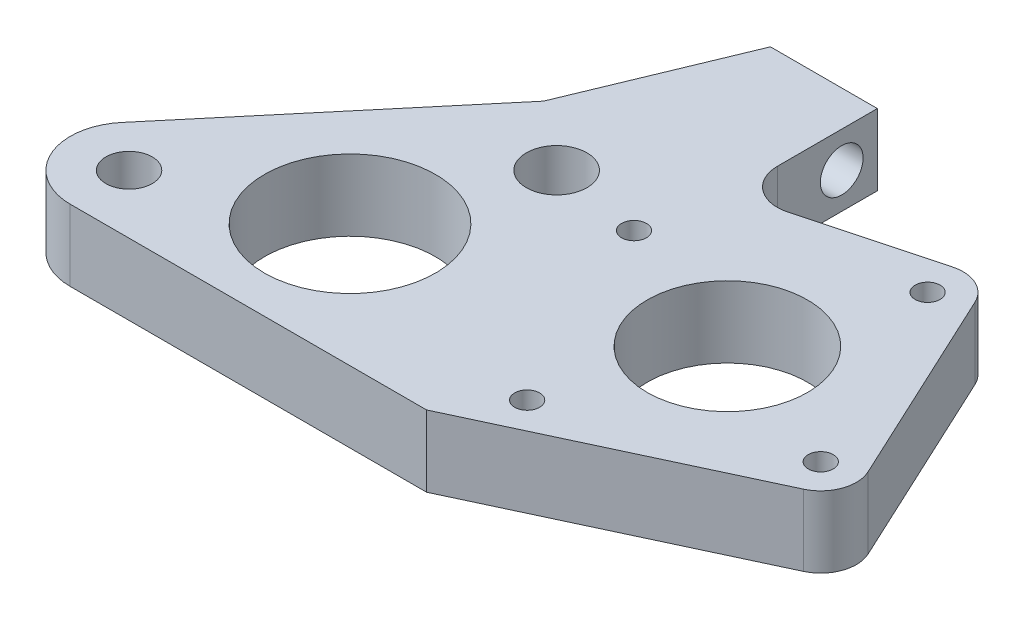
ISO-10303-21;
HEADER;
FILE_DESCRIPTION(('STEP AP214'),'2;1');
FILE_NAME('part.step','',(''),(''),'','','');
FILE_SCHEMA(('AUTOMOTIVE_DESIGN { 1 0 10303 214 1 1 1 1 }'));
ENDSEC;
DATA;
#1=APPLICATION_CONTEXT('core data for automotive mechanical design processes');
#2=APPLICATION_PROTOCOL_DEFINITION('international standard','automotive_design',2000,#1);
#3=PRODUCT_CONTEXT('',#1,'mechanical');
#4=PRODUCT('Part','Part','',(#3));
#5=PRODUCT_RELATED_PRODUCT_CATEGORY('part','',(#4));
#6=PRODUCT_DEFINITION_FORMATION('','',#4);
#7=PRODUCT_DEFINITION_CONTEXT('part definition',#1,'design');
#8=PRODUCT_DEFINITION('design','',#6,#7);
#9=PRODUCT_DEFINITION_SHAPE('','',#8);
#10=(LENGTH_UNIT() NAMED_UNIT(*) SI_UNIT(.MILLI.,.METRE.));
#11=(NAMED_UNIT(*) PLANE_ANGLE_UNIT() SI_UNIT($,.RADIAN.));
#12=(NAMED_UNIT(*) SI_UNIT($,.STERADIAN.) SOLID_ANGLE_UNIT());
#13=UNCERTAINTY_MEASURE_WITH_UNIT(LENGTH_MEASURE(1.E-05),#10,'distance_accuracy_value','');
#14=(GEOMETRIC_REPRESENTATION_CONTEXT(3) GLOBAL_UNCERTAINTY_ASSIGNED_CONTEXT((#13)) GLOBAL_UNIT_ASSIGNED_CONTEXT((#10,
#11,#12)) REPRESENTATION_CONTEXT('',''));
#15=CARTESIAN_POINT('',(0.,0.,0.));
#16=DIRECTION('',(0.,0.,1.));
#17=DIRECTION('',(1.,0.,0.));
#18=AXIS2_PLACEMENT_3D('',#15,#16,#17);
#19=CARTESIAN_POINT('',(0.,10.,0.));
#20=DIRECTION('',(0.,1.,0.));
#21=DIRECTION('',(0.,0.,1.));
#22=AXIS2_PLACEMENT_3D('',#19,#20,#21);
#23=PLANE('',#22);
#24=CARTESIAN_POINT('',(55.8611741784414,10.,0.));
#25=DIRECTION('',(0.,1.,0.));
#26=DIRECTION('',(0.,0.,1.));
#27=AXIS2_PLACEMENT_3D('',#24,#25,#26);
#28=CIRCLE('',#27,1.75);
#29=CARTESIAN_POINT('',(55.8611741784414,10.,1.75));
#30=VERTEX_POINT('',#29);
#31=EDGE_CURVE('E245',#30,#30,#28,.T.);
#32=ORIENTED_EDGE('',*,*,#31,.F.);
#33=EDGE_LOOP('',(#32));
#34=FACE_BOUND('',#33,.T.);
#35=CARTESIAN_POINT('',(70.855549462616,10.,-41.1967075120978));
#36=DIRECTION('',(0.,1.,0.));
#37=DIRECTION('',(0.,0.,1.));
#38=AXIS2_PLACEMENT_3D('',#35,#36,#37);
#39=CIRCLE('',#38,1.75);
#40=CARTESIAN_POINT('',(70.855549462616,10.,-39.4467075120978));
#41=VERTEX_POINT('',#40);
#42=EDGE_CURVE('E233',#41,#41,#39,.T.);
#43=ORIENTED_EDGE('',*,*,#42,.F.);
#44=EDGE_LOOP('',(#43));
#45=FACE_BOUND('',#44,.T.);
#46=CARTESIAN_POINT('',(63.3583618205287,10.,-20.5983537560489));
#47=DIRECTION('',(0.,1.,0.));
#48=DIRECTION('',(0.,0.,1.));
#49=AXIS2_PLACEMENT_3D('',#46,#47,#48);
#50=CIRCLE('',#49,11.25);
#51=CARTESIAN_POINT('',(63.3583618205287,10.,-9.3483537560489));
#52=VERTEX_POINT('',#51);
#53=EDGE_CURVE('E221',#52,#52,#50,.T.);
#54=ORIENTED_EDGE('',*,*,#53,.F.);
#55=EDGE_LOOP('',(#54));
#56=FACE_BOUND('',#55,.T.);
#57=CARTESIAN_POINT('',(0.,10.,0.));
#58=DIRECTION('',(0.,1.,0.));
#59=DIRECTION('',(0.,0.,1.));
#60=AXIS2_PLACEMENT_3D('',#57,#58,#59);
#61=CIRCLE('',#60,3.25);
#62=CARTESIAN_POINT('',(0.,10.,3.25));
#63=VERTEX_POINT('',#62);
#64=EDGE_CURVE('E195',#63,#63,#61,.T.);
#65=ORIENTED_EDGE('',*,*,#64,.F.);
#66=EDGE_LOOP('',(#65));
#67=FACE_BOUND('',#66,.T.);
#68=CARTESIAN_POINT('',(0.,10.,0.));
#69=DIRECTION('',(0.,1.,0.));
#70=DIRECTION('',(0.,0.,1.));
#71=AXIS2_PLACEMENT_3D('',#68,#69,#70);
#72=CIRCLE('',#71,8.25);
#73=CARTESIAN_POINT('',(-6.31986665573154,10.,-5.30299777991398));
#74=VERTEX_POINT('',#73);
#75=CARTESIAN_POINT('',(0.,10.,8.25));
#76=VERTEX_POINT('',#75);
#77=EDGE_CURVE('E131',#74,#76,#72,.T.);
#78=ORIENTED_EDGE('',*,*,#77,.T.);
#79=DIRECTION('',(1.,0.,0.));
#80=VECTOR('',#79,1.);
#81=CARTESIAN_POINT('',(0.,10.,8.25));
#82=LINE('',#81,#80);
#83=CARTESIAN_POINT('',(50.,10.,8.25));
#84=VERTEX_POINT('',#83);
#85=EDGE_CURVE('E120',#76,#84,#82,.T.);
#86=ORIENTED_EDGE('',*,*,#85,.T.);
#87=DIRECTION('',(0.906307787036651,0.,-0.422618261740698));
#88=VECTOR('',#87,1.);
#89=CARTESIAN_POINT('',(50.,10.,8.25));
#90=LINE('',#89,#88);
#91=CARTESIAN_POINT('',(86.0698068852811,10.,-8.56962717877838));
#92=VERTEX_POINT('',#91);
#93=EDGE_CURVE('E130',#84,#92,#90,.T.);
#94=ORIENTED_EDGE('',*,*,#93,.T.);
#95=CARTESIAN_POINT('',(83.9567155765776,10.,-13.1011661139616));
#96=DIRECTION('',(0.,1.,0.));
#97=DIRECTION('',(0.,0.,1.));
#98=AXIS2_PLACEMENT_3D('',#95,#96,#97);
#99=CIRCLE('',#98,4.99999999999999);
#100=CARTESIAN_POINT('',(88.4882545117608,10.,-15.2142574226651));
#101=VERTEX_POINT('',#100);
#102=EDGE_CURVE('E209',#92,#101,#99,.T.);
#103=ORIENTED_EDGE('',*,*,#102,.T.);
#104=DIRECTION('',(-0.422618261740698,0.,-0.906307787036651));
#105=VECTOR('',#104,1.);
#106=CARTESIAN_POINT('',(88.4882545117608,10.,-15.2142574226651));
#107=LINE('',#106,#105);
#108=CARTESIAN_POINT('',(75.3870883977992,10.,-43.3097988208013));
#109=VERTEX_POINT('',#108);
#110=EDGE_CURVE('E207',#101,#109,#107,.T.);
#111=ORIENTED_EDGE('',*,*,#110,.T.);
#112=CARTESIAN_POINT('',(70.855549462616,10.,-41.1967075120978));
#113=DIRECTION('',(0.,1.,0.));
#114=DIRECTION('',(0.,0.,-1.));
#115=AXIS2_PLACEMENT_3D('',#112,#113,#114);
#116=CIRCLE('',#115,4.99999999999999);
#117=CARTESIAN_POINT('',(69.5614542371034,10.,-46.0263366435431));
#118=VERTEX_POINT('',#117);
#119=EDGE_CURVE('E205',#109,#118,#116,.T.);
#120=ORIENTED_EDGE('',*,*,#119,.T.);
#121=DIRECTION('',(-0.96592582628907,0.,0.258819045102515));
#122=VECTOR('',#121,1.);
#123=CARTESIAN_POINT('',(45.,10.,-39.4451148157775));
#124=LINE('',#123,#122);
#125=CARTESIAN_POINT('',(51.2940952255126,10.,-41.1316125485381));
#126=VERTEX_POINT('',#125);
#127=EDGE_CURVE('E203',#118,#126,#124,.T.);
#128=ORIENTED_EDGE('',*,*,#127,.T.);
#129=CARTESIAN_POINT('',(50.,10.,-45.9612416799835));
#130=DIRECTION('',(0.,1.,0.));
#131=DIRECTION('',(0.,0.,1.));
#132=AXIS2_PLACEMENT_3D('',#129,#130,#131);
#133=CIRCLE('',#132,5.);
#134=CARTESIAN_POINT('',(45.,10.,-45.9612416799835));
#135=VERTEX_POINT('',#134);
#136=EDGE_CURVE('E11',#126,#135,#133,.F.);
#137=ORIENTED_EDGE('',*,*,#136,.T.);
#138=DIRECTION('',(0.,0.,-1.));
#139=VECTOR('',#138,1.);
#140=CARTESIAN_POINT('',(45.,10.,-39.4451148157775));
#141=LINE('',#140,#139);
#142=CARTESIAN_POINT('',(45.,10.,-60.));
#143=VERTEX_POINT('',#142);
#144=EDGE_CURVE('E201',#135,#143,#141,.T.);
#145=ORIENTED_EDGE('',*,*,#144,.T.);
#146=DIRECTION('',(-1.,0.,0.));
#147=VECTOR('',#146,1.);
#148=CARTESIAN_POINT('',(45.,10.,-60.));
#149=LINE('',#148,#147);
#150=CARTESIAN_POINT('',(30.,10.,-60.));
#151=VERTEX_POINT('',#150);
#152=EDGE_CURVE('E199',#143,#151,#149,.T.);
#153=ORIENTED_EDGE('',*,*,#152,.T.);
#154=DIRECTION('',(-0.382452275523413,0.,0.923975246934117));
#155=VECTOR('',#154,1.);
#156=CARTESIAN_POINT('',(30.,10.,-60.));
#157=LINE('',#156,#155);
#158=CARTESIAN_POINT('',(20.6772129511033,10.,-37.4768643909109));
#159=VERTEX_POINT('',#158);
#160=EDGE_CURVE('E197',#151,#159,#157,.T.);
#161=ORIENTED_EDGE('',*,*,#160,.T.);
#162=DIRECTION('',(-0.642787609686543,0.,0.766044443118975));
#163=VECTOR('',#162,1.);
#164=CARTESIAN_POINT('',(20.6772129511033,10.,-37.4768643909109));
#165=LINE('',#164,#163);
#166=EDGE_CURVE('E136',#159,#74,#165,.T.);
#167=ORIENTED_EDGE('',*,*,#166,.T.);
#168=EDGE_LOOP('',(#78,#86,#94,#103,#111,#120,#128,#137,#145,#153,#161,#167));
#169=FACE_BOUND('',#168,.T.);
#170=CARTESIAN_POINT('',(30.,10.,-30.));
#171=DIRECTION('',(0.,1.,0.));
#172=DIRECTION('',(0.,0.,1.));
#173=AXIS2_PLACEMENT_3D('',#170,#171,#172);
#174=CIRCLE('',#173,4.25000000000001);
#175=CARTESIAN_POINT('',(30.,10.,-25.75));
#176=VERTEX_POINT('',#175);
#177=EDGE_CURVE('E215',#176,#176,#174,.T.);
#178=ORIENTED_EDGE('',*,*,#177,.F.);
#179=EDGE_LOOP('',(#178));
#180=FACE_BOUND('',#179,.T.);
#181=CARTESIAN_POINT('',(42.7600080644798,10.,-28.0955413981362));
#182=DIRECTION('',(0.,1.,0.));
#183=DIRECTION('',(0.,0.,1.));
#184=AXIS2_PLACEMENT_3D('',#181,#182,#183);
#185=CIRCLE('',#184,1.75);
#186=CARTESIAN_POINT('',(42.7600080644798,10.,-26.3455413981362));
#187=VERTEX_POINT('',#186);
#188=EDGE_CURVE('E227',#187,#187,#185,.T.);
#189=ORIENTED_EDGE('',*,*,#188,.F.);
#190=EDGE_LOOP('',(#189));
#191=FACE_BOUND('',#190,.T.);
#192=CARTESIAN_POINT('',(83.9567155765776,10.,-13.1011661139616));
#193=DIRECTION('',(0.,1.,0.));
#194=DIRECTION('',(0.,0.,1.));
#195=AXIS2_PLACEMENT_3D('',#192,#193,#194);
#196=CIRCLE('',#195,1.75);
#197=CARTESIAN_POINT('',(83.9567155765776,10.,-11.3511661139616));
#198=VERTEX_POINT('',#197);
#199=EDGE_CURVE('E239',#198,#198,#196,.T.);
#200=ORIENTED_EDGE('',*,*,#199,.F.);
#201=EDGE_LOOP('',(#200));
#202=FACE_BOUND('',#201,.T.);
#203=CARTESIAN_POINT('',(22.,10.,-9.));
#204=DIRECTION('',(0.,1.,0.));
#205=DIRECTION('',(0.,0.,1.));
#206=AXIS2_PLACEMENT_3D('',#203,#204,#205);
#207=CIRCLE('',#206,12.);
#208=CARTESIAN_POINT('',(22.,10.,3.00000000000001));
#209=VERTEX_POINT('',#208);
#210=EDGE_CURVE('E251',#209,#209,#207,.T.);
#211=ORIENTED_EDGE('',*,*,#210,.F.);
#212=EDGE_LOOP('',(#211));
#213=FACE_BOUND('',#212,.T.);
#214=ADVANCED_FACE('F31',(#34,#45,#56,#67,#169,#180,#191,#202,#213),#23,.T.);
#215=CARTESIAN_POINT('',(0.,0.,0.));
#216=DIRECTION('',(0.,1.,0.));
#217=DIRECTION('',(0.,0.,1.));
#218=AXIS2_PLACEMENT_3D('',#215,#216,#217);
#219=PLANE('',#218);
#220=CARTESIAN_POINT('',(55.8611741784414,0.,0.));
#221=DIRECTION('',(0.,1.,0.));
#222=DIRECTION('',(0.,0.,1.));
#223=AXIS2_PLACEMENT_3D('',#220,#221,#222);
#224=CIRCLE('',#223,1.75);
#225=CARTESIAN_POINT('',(55.8611741784414,0.,1.75));
#226=VERTEX_POINT('',#225);
#227=EDGE_CURVE('E248',#226,#226,#224,.T.);
#228=ORIENTED_EDGE('',*,*,#227,.T.);
#229=EDGE_LOOP('',(#228));
#230=FACE_BOUND('',#229,.T.);
#231=CARTESIAN_POINT('',(70.855549462616,0.,-41.1967075120978));
#232=DIRECTION('',(0.,1.,0.));
#233=DIRECTION('',(0.,0.,1.));
#234=AXIS2_PLACEMENT_3D('',#231,#232,#233);
#235=CIRCLE('',#234,1.75);
#236=CARTESIAN_POINT('',(70.855549462616,0.,-39.4467075120978));
#237=VERTEX_POINT('',#236);
#238=EDGE_CURVE('E236',#237,#237,#235,.T.);
#239=ORIENTED_EDGE('',*,*,#238,.T.);
#240=EDGE_LOOP('',(#239));
#241=FACE_BOUND('',#240,.T.);
#242=CARTESIAN_POINT('',(63.3583618205287,0.,-20.5983537560489));
#243=DIRECTION('',(0.,1.,0.));
#244=DIRECTION('',(0.,0.,1.));
#245=AXIS2_PLACEMENT_3D('',#242,#243,#244);
#246=CIRCLE('',#245,11.25);
#247=CARTESIAN_POINT('',(63.3583618205287,0.,-9.3483537560489));
#248=VERTEX_POINT('',#247);
#249=EDGE_CURVE('E224',#248,#248,#246,.T.);
#250=ORIENTED_EDGE('',*,*,#249,.T.);
#251=EDGE_LOOP('',(#250));
#252=FACE_BOUND('',#251,.T.);
#253=CARTESIAN_POINT('',(0.,0.,0.));
#254=DIRECTION('',(0.,1.,0.));
#255=DIRECTION('',(0.,0.,1.));
#256=AXIS2_PLACEMENT_3D('',#253,#254,#255);
#257=CIRCLE('',#256,3.25);
#258=CARTESIAN_POINT('',(0.,0.,3.25));
#259=VERTEX_POINT('',#258);
#260=EDGE_CURVE('E212',#259,#259,#257,.T.);
#261=ORIENTED_EDGE('',*,*,#260,.T.);
#262=EDGE_LOOP('',(#261));
#263=FACE_BOUND('',#262,.T.);
#264=CARTESIAN_POINT('',(0.,0.,0.));
#265=DIRECTION('',(0.,1.,0.));
#266=DIRECTION('',(0.,0.,1.));
#267=AXIS2_PLACEMENT_3D('',#264,#265,#266);
#268=CIRCLE('',#267,8.25);
#269=CARTESIAN_POINT('',(-6.31986665573154,0.,-5.30299777991398));
#270=VERTEX_POINT('',#269);
#271=CARTESIAN_POINT('',(0.,0.,8.25));
#272=VERTEX_POINT('',#271);
#273=EDGE_CURVE('E144',#270,#272,#268,.T.);
#274=ORIENTED_EDGE('',*,*,#273,.F.);
#275=DIRECTION('',(-0.642787609686543,0.,0.766044443118975));
#276=VECTOR('',#275,1.);
#277=CARTESIAN_POINT('',(20.6772129511033,0.,-37.4768643909109));
#278=LINE('',#277,#276);
#279=CARTESIAN_POINT('',(20.6772129511033,0.,-37.4768643909109));
#280=VERTEX_POINT('',#279);
#281=EDGE_CURVE('E140',#280,#270,#278,.T.);
#282=ORIENTED_EDGE('',*,*,#281,.F.);
#283=DIRECTION('',(-0.382452275523413,0.,0.923975246934117));
#284=VECTOR('',#283,1.);
#285=CARTESIAN_POINT('',(30.,0.,-60.));
#286=LINE('',#285,#284);
#287=CARTESIAN_POINT('',(30.,0.,-60.));
#288=VERTEX_POINT('',#287);
#289=EDGE_CURVE('E176',#288,#280,#286,.T.);
#290=ORIENTED_EDGE('',*,*,#289,.F.);
#291=DIRECTION('',(-1.,0.,0.));
#292=VECTOR('',#291,1.);
#293=CARTESIAN_POINT('',(45.,0.,-60.));
#294=LINE('',#293,#292);
#295=CARTESIAN_POINT('',(45.,0.,-60.));
#296=VERTEX_POINT('',#295);
#297=EDGE_CURVE('E178',#296,#288,#294,.T.);
#298=ORIENTED_EDGE('',*,*,#297,.F.);
#299=DIRECTION('',(0.,0.,-1.));
#300=VECTOR('',#299,1.);
#301=CARTESIAN_POINT('',(45.,0.,-39.4451148157775));
#302=LINE('',#301,#300);
#303=CARTESIAN_POINT('',(45.,0.,-45.9612416799835));
#304=VERTEX_POINT('',#303);
#305=EDGE_CURVE('E180',#304,#296,#302,.T.);
#306=ORIENTED_EDGE('',*,*,#305,.F.);
#307=CARTESIAN_POINT('',(50.,0.,-45.9612416799835));
#308=DIRECTION('',(0.,1.,0.));
#309=DIRECTION('',(0.,0.,1.));
#310=AXIS2_PLACEMENT_3D('',#307,#308,#309);
#311=CIRCLE('',#310,5.);
#312=CARTESIAN_POINT('',(51.2940952255126,0.,-41.1316125485381));
#313=VERTEX_POINT('',#312);
#314=EDGE_CURVE('E39',#304,#313,#311,.T.);
#315=ORIENTED_EDGE('',*,*,#314,.T.);
#316=DIRECTION('',(-0.96592582628907,0.,0.258819045102515));
#317=VECTOR('',#316,1.);
#318=CARTESIAN_POINT('',(45.,0.,-39.4451148157775));
#319=LINE('',#318,#317);
#320=CARTESIAN_POINT('',(69.5614542371034,0.,-46.0263366435431));
#321=VERTEX_POINT('',#320);
#322=EDGE_CURVE('E182',#321,#313,#319,.T.);
#323=ORIENTED_EDGE('',*,*,#322,.F.);
#324=CARTESIAN_POINT('',(70.855549462616,0.,-41.1967075120978));
#325=DIRECTION('',(0.,1.,0.));
#326=DIRECTION('',(0.,0.,-1.));
#327=AXIS2_PLACEMENT_3D('',#324,#325,#326);
#328=CIRCLE('',#327,4.99999999999999);
#329=CARTESIAN_POINT('',(75.3870883977992,0.,-43.3097988208013));
#330=VERTEX_POINT('',#329);
#331=EDGE_CURVE('E184',#330,#321,#328,.T.);
#332=ORIENTED_EDGE('',*,*,#331,.F.);
#333=DIRECTION('',(-0.422618261740698,0.,-0.906307787036651));
#334=VECTOR('',#333,1.);
#335=CARTESIAN_POINT('',(88.4882545117608,0.,-15.2142574226651));
#336=LINE('',#335,#334);
#337=CARTESIAN_POINT('',(88.4882545117608,0.,-15.2142574226651));
#338=VERTEX_POINT('',#337);
#339=EDGE_CURVE('E186',#338,#330,#336,.T.);
#340=ORIENTED_EDGE('',*,*,#339,.F.);
#341=CARTESIAN_POINT('',(83.9567155765776,0.,-13.1011661139616));
#342=DIRECTION('',(0.,1.,0.));
#343=DIRECTION('',(0.,0.,1.));
#344=AXIS2_PLACEMENT_3D('',#341,#342,#343);
#345=CIRCLE('',#344,4.99999999999999);
#346=CARTESIAN_POINT('',(86.0698068852811,0.,-8.56962717877838));
#347=VERTEX_POINT('',#346);
#348=EDGE_CURVE('E188',#347,#338,#345,.T.);
#349=ORIENTED_EDGE('',*,*,#348,.F.);
#350=DIRECTION('',(0.906307787036651,0.,-0.422618261740698));
#351=VECTOR('',#350,1.);
#352=CARTESIAN_POINT('',(50.,0.,8.25));
#353=LINE('',#352,#351);
#354=CARTESIAN_POINT('',(50.,0.,8.25));
#355=VERTEX_POINT('',#354);
#356=EDGE_CURVE('E190',#355,#347,#353,.T.);
#357=ORIENTED_EDGE('',*,*,#356,.F.);
#358=DIRECTION('',(1.,0.,0.));
#359=VECTOR('',#358,1.);
#360=CARTESIAN_POINT('',(0.,0.,8.25));
#361=LINE('',#360,#359);
#362=EDGE_CURVE('E192',#272,#355,#361,.T.);
#363=ORIENTED_EDGE('',*,*,#362,.F.);
#364=EDGE_LOOP('',(#274,#282,#290,#298,#306,#315,#323,#332,#340,#349,#357,#363));
#365=FACE_BOUND('',#364,.T.);
#366=CARTESIAN_POINT('',(30.,0.,-30.));
#367=DIRECTION('',(0.,1.,0.));
#368=DIRECTION('',(0.,0.,1.));
#369=AXIS2_PLACEMENT_3D('',#366,#367,#368);
#370=CIRCLE('',#369,4.25000000000001);
#371=CARTESIAN_POINT('',(30.,0.,-25.75));
#372=VERTEX_POINT('',#371);
#373=EDGE_CURVE('E218',#372,#372,#370,.T.);
#374=ORIENTED_EDGE('',*,*,#373,.T.);
#375=EDGE_LOOP('',(#374));
#376=FACE_BOUND('',#375,.T.);
#377=CARTESIAN_POINT('',(42.7600080644798,0.,-28.0955413981362));
#378=DIRECTION('',(0.,1.,0.));
#379=DIRECTION('',(0.,0.,1.));
#380=AXIS2_PLACEMENT_3D('',#377,#378,#379);
#381=CIRCLE('',#380,1.75);
#382=CARTESIAN_POINT('',(42.7600080644798,0.,-26.3455413981362));
#383=VERTEX_POINT('',#382);
#384=EDGE_CURVE('E230',#383,#383,#381,.T.);
#385=ORIENTED_EDGE('',*,*,#384,.T.);
#386=EDGE_LOOP('',(#385));
#387=FACE_BOUND('',#386,.T.);
#388=CARTESIAN_POINT('',(83.9567155765776,0.,-13.1011661139616));
#389=DIRECTION('',(0.,1.,0.));
#390=DIRECTION('',(0.,0.,1.));
#391=AXIS2_PLACEMENT_3D('',#388,#389,#390);
#392=CIRCLE('',#391,1.75);
#393=CARTESIAN_POINT('',(83.9567155765776,0.,-11.3511661139616));
#394=VERTEX_POINT('',#393);
#395=EDGE_CURVE('E242',#394,#394,#392,.T.);
#396=ORIENTED_EDGE('',*,*,#395,.T.);
#397=EDGE_LOOP('',(#396));
#398=FACE_BOUND('',#397,.T.);
#399=CARTESIAN_POINT('',(22.,0.,-9.));
#400=DIRECTION('',(0.,1.,0.));
#401=DIRECTION('',(0.,0.,1.));
#402=AXIS2_PLACEMENT_3D('',#399,#400,#401);
#403=CIRCLE('',#402,12.);
#404=CARTESIAN_POINT('',(22.,0.,3.00000000000001));
#405=VERTEX_POINT('',#404);
#406=EDGE_CURVE('E254',#405,#405,#403,.T.);
#407=ORIENTED_EDGE('',*,*,#406,.T.);
#408=EDGE_LOOP('',(#407));
#409=FACE_BOUND('',#408,.T.);
#410=ADVANCED_FACE('F290',(#230,#241,#252,#263,#365,#376,#387,#398,#409),#219,.F.);
#411=CARTESIAN_POINT('',(0.,10.,0.));
#412=DIRECTION('',(0.,-1.,0.));
#413=DIRECTION('',(0.,0.,-1.));
#414=AXIS2_PLACEMENT_3D('',#411,#412,#413);
#415=CYLINDRICAL_SURFACE('',#414,8.25);
#416=ORIENTED_EDGE('',*,*,#273,.T.);
#417=DIRECTION('',(0.,-1.,0.));
#418=VECTOR('',#417,1.);
#419=CARTESIAN_POINT('',(0.,10.,8.25));
#420=LINE('',#419,#418);
#421=EDGE_CURVE('E124',#76,#272,#420,.T.);
#422=ORIENTED_EDGE('',*,*,#421,.F.);
#423=ORIENTED_EDGE('',*,*,#77,.F.);
#424=DIRECTION('',(0.,-1.,0.));
#425=VECTOR('',#424,1.);
#426=CARTESIAN_POINT('',(-6.31986665573154,10.,-5.30299777991398));
#427=LINE('',#426,#425);
#428=EDGE_CURVE('E173',#74,#270,#427,.T.);
#429=ORIENTED_EDGE('',*,*,#428,.T.);
#430=EDGE_LOOP('',(#416,#422,#423,#429));
#431=FACE_BOUND('',#430,.T.);
#432=ADVANCED_FACE('F142',(#431),#415,.T.);
#433=CARTESIAN_POINT('',(0.,10.,8.25));
#434=DIRECTION('',(0.,0.,-1.));
#435=DIRECTION('',(-1.,0.,0.));
#436=AXIS2_PLACEMENT_3D('',#433,#434,#435);
#437=PLANE('',#436);
#438=ORIENTED_EDGE('',*,*,#362,.T.);
#439=DIRECTION('',(0.,-1.,0.));
#440=VECTOR('',#439,1.);
#441=CARTESIAN_POINT('',(50.,10.,8.25));
#442=LINE('',#441,#440);
#443=EDGE_CURVE('E127',#84,#355,#442,.T.);
#444=ORIENTED_EDGE('',*,*,#443,.F.);
#445=ORIENTED_EDGE('',*,*,#85,.F.);
#446=ORIENTED_EDGE('',*,*,#421,.T.);
#447=EDGE_LOOP('',(#438,#444,#445,#446));
#448=FACE_BOUND('',#447,.T.);
#449=ADVANCED_FACE('F122',(#448),#437,.F.);
#450=CARTESIAN_POINT('',(50.,10.,8.25));
#451=DIRECTION('',(-0.422618261740698,0.,-0.906307787036651));
#452=DIRECTION('',(-0.906307787036651,0.,0.422618261740698));
#453=AXIS2_PLACEMENT_3D('',#450,#451,#452);
#454=PLANE('',#453);
#455=ORIENTED_EDGE('',*,*,#356,.T.);
#456=DIRECTION('',(0.,-1.,0.));
#457=VECTOR('',#456,1.);
#458=CARTESIAN_POINT('',(86.0698068852811,10.,-8.56962717877838));
#459=LINE('',#458,#457);
#460=EDGE_CURVE('E149',#92,#347,#459,.T.);
#461=ORIENTED_EDGE('',*,*,#460,.F.);
#462=ORIENTED_EDGE('',*,*,#93,.F.);
#463=ORIENTED_EDGE('',*,*,#443,.T.);
#464=EDGE_LOOP('',(#455,#461,#462,#463));
#465=FACE_BOUND('',#464,.T.);
#466=ADVANCED_FACE('F306',(#465),#454,.F.);
#467=CARTESIAN_POINT('',(83.9567155765776,10.,-13.1011661139616));
#468=DIRECTION('',(0.,-1.,0.));
#469=DIRECTION('',(0.,0.,-1.));
#470=AXIS2_PLACEMENT_3D('',#467,#468,#469);
#471=CYLINDRICAL_SURFACE('',#470,4.99999999999999);
#472=ORIENTED_EDGE('',*,*,#348,.T.);
#473=DIRECTION('',(0.,-1.,0.));
#474=VECTOR('',#473,1.);
#475=CARTESIAN_POINT('',(88.4882545117608,10.,-15.2142574226651));
#476=LINE('',#475,#474);
#477=EDGE_CURVE('E155',#101,#338,#476,.T.);
#478=ORIENTED_EDGE('',*,*,#477,.F.);
#479=ORIENTED_EDGE('',*,*,#102,.F.);
#480=ORIENTED_EDGE('',*,*,#460,.T.);
#481=EDGE_LOOP('',(#472,#478,#479,#480));
#482=FACE_BOUND('',#481,.T.);
#483=ADVANCED_FACE('F302',(#482),#471,.T.);
#484=CARTESIAN_POINT('',(88.4882545117608,10.,-15.2142574226651));
#485=DIRECTION('',(-0.906307787036651,0.,0.422618261740698));
#486=DIRECTION('',(0.422618261740698,0.,0.906307787036651));
#487=AXIS2_PLACEMENT_3D('',#484,#485,#486);
#488=PLANE('',#487);
#489=ORIENTED_EDGE('',*,*,#339,.T.);
#490=DIRECTION('',(0.,-1.,0.));
#491=VECTOR('',#490,1.);
#492=CARTESIAN_POINT('',(75.3870883977992,10.,-43.3097988208013));
#493=LINE('',#492,#491);
#494=EDGE_CURVE('E158',#109,#330,#493,.T.);
#495=ORIENTED_EDGE('',*,*,#494,.F.);
#496=ORIENTED_EDGE('',*,*,#110,.F.);
#497=ORIENTED_EDGE('',*,*,#477,.T.);
#498=EDGE_LOOP('',(#489,#495,#496,#497));
#499=FACE_BOUND('',#498,.T.);
#500=ADVANCED_FACE('F298',(#499),#488,.F.);
#501=CARTESIAN_POINT('',(70.855549462616,10.,-41.1967075120978));
#502=DIRECTION('',(0.,-1.,0.));
#503=DIRECTION('',(0.,0.,-1.));
#504=AXIS2_PLACEMENT_3D('',#501,#502,#503);
#505=CYLINDRICAL_SURFACE('',#504,4.99999999999999);
#506=ORIENTED_EDGE('',*,*,#331,.T.);
#507=DIRECTION('',(0.,-1.,0.));
#508=VECTOR('',#507,1.);
#509=CARTESIAN_POINT('',(69.5614542371034,10.,-46.0263366435431));
#510=LINE('',#509,#508);
#511=EDGE_CURVE('E161',#118,#321,#510,.T.);
#512=ORIENTED_EDGE('',*,*,#511,.F.);
#513=ORIENTED_EDGE('',*,*,#119,.F.);
#514=ORIENTED_EDGE('',*,*,#494,.T.);
#515=EDGE_LOOP('',(#506,#512,#513,#514));
#516=FACE_BOUND('',#515,.T.);
#517=ADVANCED_FACE('F294',(#516),#505,.T.);
#518=CARTESIAN_POINT('',(45.,10.,-39.4451148157775));
#519=DIRECTION('',(0.258819045102515,0.,0.96592582628907));
#520=DIRECTION('',(0.96592582628907,0.,-0.258819045102515));
#521=AXIS2_PLACEMENT_3D('',#518,#519,#520);
#522=PLANE('',#521);
#523=ORIENTED_EDGE('',*,*,#322,.T.);
#524=DIRECTION('',(0.,-1.,0.));
#525=VECTOR('',#524,1.);
#526=CARTESIAN_POINT('',(51.2940952255126,10.,-41.1316125485381));
#527=LINE('',#526,#525);
#528=EDGE_CURVE('E46',#313,#126,#527,.F.);
#529=ORIENTED_EDGE('',*,*,#528,.T.);
#530=ORIENTED_EDGE('',*,*,#127,.F.);
#531=ORIENTED_EDGE('',*,*,#511,.T.);
#532=EDGE_LOOP('',(#523,#529,#530,#531));
#533=FACE_BOUND('',#532,.T.);
#534=ADVANCED_FACE('F278',(#533),#522,.F.);
#535=CARTESIAN_POINT('',(45.,10.,-39.4451148157775));
#536=DIRECTION('',(-1.,0.,0.));
#537=DIRECTION('',(0.,0.,1.));
#538=AXIS2_PLACEMENT_3D('',#535,#536,#537);
#539=PLANE('',#538);
#540=CARTESIAN_POINT('',(45.,5.,-55.));
#541=DIRECTION('',(1.,0.,0.));
#542=DIRECTION('',(0.,0.,-1.));
#543=AXIS2_PLACEMENT_3D('',#540,#541,#542);
#544=CIRCLE('',#543,3.);
#545=CARTESIAN_POINT('',(45.,5.,-58.));
#546=VERTEX_POINT('',#545);
#547=EDGE_CURVE('E260',#546,#546,#544,.T.);
#548=ORIENTED_EDGE('',*,*,#547,.F.);
#549=EDGE_LOOP('',(#548));
#550=FACE_BOUND('',#549,.T.);
#551=ORIENTED_EDGE('',*,*,#144,.F.);
#552=DIRECTION('',(0.,-1.,0.));
#553=VECTOR('',#552,1.);
#554=CARTESIAN_POINT('',(45.,0.,-45.9612416799835));
#555=LINE('',#554,#553);
#556=EDGE_CURVE('E145',#135,#304,#555,.T.);
#557=ORIENTED_EDGE('',*,*,#556,.T.);
#558=ORIENTED_EDGE('',*,*,#305,.T.);
#559=DIRECTION('',(0.,-1.,0.));
#560=VECTOR('',#559,1.);
#561=CARTESIAN_POINT('',(45.,10.,-60.));
#562=LINE('',#561,#560);
#563=EDGE_CURVE('E164',#143,#296,#562,.T.);
#564=ORIENTED_EDGE('',*,*,#563,.F.);
#565=EDGE_LOOP('',(#551,#557,#558,#564));
#566=FACE_BOUND('',#565,.T.);
#567=ADVANCED_FACE('F274',(#550,#566),#539,.F.);
#568=CARTESIAN_POINT('',(45.,10.,-60.));
#569=DIRECTION('',(0.,0.,1.));
#570=DIRECTION('',(1.,0.,0.));
#571=AXIS2_PLACEMENT_3D('',#568,#569,#570);
#572=PLANE('',#571);
#573=ORIENTED_EDGE('',*,*,#297,.T.);
#574=DIRECTION('',(0.,-1.,0.));
#575=VECTOR('',#574,1.);
#576=CARTESIAN_POINT('',(30.,10.,-60.));
#577=LINE('',#576,#575);
#578=EDGE_CURVE('E167',#151,#288,#577,.T.);
#579=ORIENTED_EDGE('',*,*,#578,.F.);
#580=ORIENTED_EDGE('',*,*,#152,.F.);
#581=ORIENTED_EDGE('',*,*,#563,.T.);
#582=EDGE_LOOP('',(#573,#579,#580,#581));
#583=FACE_BOUND('',#582,.T.);
#584=ADVANCED_FACE('F277',(#583),#572,.F.);
#585=CARTESIAN_POINT('',(30.,10.,-60.));
#586=DIRECTION('',(0.923975246934117,0.,0.382452275523413));
#587=DIRECTION('',(0.382452275523413,0.,-0.923975246934117));
#588=AXIS2_PLACEMENT_3D('',#585,#586,#587);
#589=PLANE('',#588);
#590=ORIENTED_EDGE('',*,*,#289,.T.);
#591=DIRECTION('',(0.,-1.,0.));
#592=VECTOR('',#591,1.);
#593=CARTESIAN_POINT('',(20.6772129511033,10.,-37.4768643909109));
#594=LINE('',#593,#592);
#595=EDGE_CURVE('E170',#159,#280,#594,.T.);
#596=ORIENTED_EDGE('',*,*,#595,.F.);
#597=ORIENTED_EDGE('',*,*,#160,.F.);
#598=ORIENTED_EDGE('',*,*,#578,.T.);
#599=EDGE_LOOP('',(#590,#596,#597,#598));
#600=FACE_BOUND('',#599,.T.);
#601=ADVANCED_FACE('F332',(#600),#589,.F.);
#602=CARTESIAN_POINT('',(20.6772129511033,10.,-37.4768643909109));
#603=DIRECTION('',(0.766044443118975,0.,0.642787609686543));
#604=DIRECTION('',(0.642787609686543,0.,-0.766044443118975));
#605=AXIS2_PLACEMENT_3D('',#602,#603,#604);
#606=PLANE('',#605);
#607=ORIENTED_EDGE('',*,*,#281,.T.);
#608=ORIENTED_EDGE('',*,*,#428,.F.);
#609=ORIENTED_EDGE('',*,*,#166,.F.);
#610=ORIENTED_EDGE('',*,*,#595,.T.);
#611=EDGE_LOOP('',(#607,#608,#609,#610));
#612=FACE_BOUND('',#611,.T.);
#613=ADVANCED_FACE('F329',(#612),#606,.F.);
#614=CARTESIAN_POINT('',(0.,10.,0.));
#615=DIRECTION('',(0.,-1.,0.));
#616=DIRECTION('',(0.,0.,-1.));
#617=AXIS2_PLACEMENT_3D('',#614,#615,#616);
#618=CYLINDRICAL_SURFACE('',#617,3.25);
#619=ORIENTED_EDGE('',*,*,#64,.T.);
#620=EDGE_LOOP('',(#619));
#621=FACE_BOUND('',#620,.T.);
#622=ORIENTED_EDGE('',*,*,#260,.F.);
#623=EDGE_LOOP('',(#622));
#624=FACE_BOUND('',#623,.T.);
#625=ADVANCED_FACE('F326',(#621,#624),#618,.F.);
#626=CARTESIAN_POINT('',(30.,10.,-30.));
#627=DIRECTION('',(0.,-1.,0.));
#628=DIRECTION('',(0.,0.,-1.));
#629=AXIS2_PLACEMENT_3D('',#626,#627,#628);
#630=CYLINDRICAL_SURFACE('',#629,4.25000000000001);
#631=ORIENTED_EDGE('',*,*,#177,.T.);
#632=EDGE_LOOP('',(#631));
#633=FACE_BOUND('',#632,.T.);
#634=ORIENTED_EDGE('',*,*,#373,.F.);
#635=EDGE_LOOP('',(#634));
#636=FACE_BOUND('',#635,.T.);
#637=ADVANCED_FACE('F382',(#633,#636),#630,.F.);
#638=CARTESIAN_POINT('',(63.3583618205287,10.,-20.5983537560489));
#639=DIRECTION('',(0.,-1.,0.));
#640=DIRECTION('',(0.,0.,-1.));
#641=AXIS2_PLACEMENT_3D('',#638,#639,#640);
#642=CYLINDRICAL_SURFACE('',#641,11.25);
#643=ORIENTED_EDGE('',*,*,#53,.T.);
#644=EDGE_LOOP('',(#643));
#645=FACE_BOUND('',#644,.T.);
#646=ORIENTED_EDGE('',*,*,#249,.F.);
#647=EDGE_LOOP('',(#646));
#648=FACE_BOUND('',#647,.T.);
#649=ADVANCED_FACE('F389',(#645,#648),#642,.F.);
#650=CARTESIAN_POINT('',(42.7600080644798,10.,-28.0955413981362));
#651=DIRECTION('',(0.,-1.,0.));
#652=DIRECTION('',(0.,0.,-1.));
#653=AXIS2_PLACEMENT_3D('',#650,#651,#652);
#654=CYLINDRICAL_SURFACE('',#653,1.75);
#655=ORIENTED_EDGE('',*,*,#188,.T.);
#656=EDGE_LOOP('',(#655));
#657=FACE_BOUND('',#656,.T.);
#658=ORIENTED_EDGE('',*,*,#384,.F.);
#659=EDGE_LOOP('',(#658));
#660=FACE_BOUND('',#659,.T.);
#661=ADVANCED_FACE('F396',(#657,#660),#654,.F.);
#662=CARTESIAN_POINT('',(70.855549462616,10.,-41.1967075120978));
#663=DIRECTION('',(0.,-1.,0.));
#664=DIRECTION('',(0.,0.,-1.));
#665=AXIS2_PLACEMENT_3D('',#662,#663,#664);
#666=CYLINDRICAL_SURFACE('',#665,1.75);
#667=ORIENTED_EDGE('',*,*,#42,.T.);
#668=EDGE_LOOP('',(#667));
#669=FACE_BOUND('',#668,.T.);
#670=ORIENTED_EDGE('',*,*,#238,.F.);
#671=EDGE_LOOP('',(#670));
#672=FACE_BOUND('',#671,.T.);
#673=ADVANCED_FACE('F404',(#669,#672),#666,.F.);
#674=CARTESIAN_POINT('',(83.9567155765776,10.,-13.1011661139616));
#675=DIRECTION('',(0.,-1.,0.));
#676=DIRECTION('',(0.,0.,-1.));
#677=AXIS2_PLACEMENT_3D('',#674,#675,#676);
#678=CYLINDRICAL_SURFACE('',#677,1.75);
#679=ORIENTED_EDGE('',*,*,#199,.T.);
#680=EDGE_LOOP('',(#679));
#681=FACE_BOUND('',#680,.T.);
#682=ORIENTED_EDGE('',*,*,#395,.F.);
#683=EDGE_LOOP('',(#682));
#684=FACE_BOUND('',#683,.T.);
#685=ADVANCED_FACE('F412',(#681,#684),#678,.F.);
#686=CARTESIAN_POINT('',(55.8611741784414,10.,0.));
#687=DIRECTION('',(0.,-1.,0.));
#688=DIRECTION('',(0.,0.,-1.));
#689=AXIS2_PLACEMENT_3D('',#686,#687,#688);
#690=CYLINDRICAL_SURFACE('',#689,1.75);
#691=ORIENTED_EDGE('',*,*,#31,.T.);
#692=EDGE_LOOP('',(#691));
#693=FACE_BOUND('',#692,.T.);
#694=ORIENTED_EDGE('',*,*,#227,.F.);
#695=EDGE_LOOP('',(#694));
#696=FACE_BOUND('',#695,.T.);
#697=ADVANCED_FACE('F420',(#693,#696),#690,.F.);
#698=CARTESIAN_POINT('',(22.,10.,-9.));
#699=DIRECTION('',(0.,-1.,0.));
#700=DIRECTION('',(0.,0.,-1.));
#701=AXIS2_PLACEMENT_3D('',#698,#699,#700);
#702=CYLINDRICAL_SURFACE('',#701,12.);
#703=ORIENTED_EDGE('',*,*,#210,.T.);
#704=EDGE_LOOP('',(#703));
#705=FACE_BOUND('',#704,.T.);
#706=ORIENTED_EDGE('',*,*,#406,.F.);
#707=EDGE_LOOP('',(#706));
#708=FACE_BOUND('',#707,.T.);
#709=ADVANCED_FACE('F428',(#705,#708),#702,.F.);
#710=CARTESIAN_POINT('',(50.,10.,-45.9612416799835));
#711=DIRECTION('',(0.,1.,0.));
#712=DIRECTION('',(0.,0.,1.));
#713=AXIS2_PLACEMENT_3D('',#710,#711,#712);
#714=CYLINDRICAL_SURFACE('',#713,5.);
#715=ORIENTED_EDGE('',*,*,#136,.F.);
#716=ORIENTED_EDGE('',*,*,#528,.F.);
#717=ORIENTED_EDGE('',*,*,#314,.F.);
#718=ORIENTED_EDGE('',*,*,#556,.F.);
#719=EDGE_LOOP('',(#715,#716,#717,#718));
#720=FACE_BOUND('',#719,.T.);
#721=ADVANCED_FACE('F33',(#720),#714,.F.);
#722=CARTESIAN_POINT('',(35.,5.,-55.));
#723=DIRECTION('',(1.,0.,0.));
#724=DIRECTION('',(0.,0.,-1.));
#725=AXIS2_PLACEMENT_3D('',#722,#723,#724);
#726=CYLINDRICAL_SURFACE('',#725,3.);
#727=CARTESIAN_POINT('',(35.,5.,-55.));
#728=DIRECTION('',(1.,0.,0.));
#729=DIRECTION('',(0.,0.,-1.));
#730=AXIS2_PLACEMENT_3D('',#727,#728,#729);
#731=CIRCLE('',#730,3.);
#732=CARTESIAN_POINT('',(35.,5.,-58.));
#733=VERTEX_POINT('',#732);
#734=EDGE_CURVE('E257',#733,#733,#731,.T.);
#735=ORIENTED_EDGE('',*,*,#734,.F.);
#736=EDGE_LOOP('',(#735));
#737=FACE_BOUND('',#736,.T.);
#738=ORIENTED_EDGE('',*,*,#547,.T.);
#739=EDGE_LOOP('',(#738));
#740=FACE_BOUND('',#739,.T.);
#741=ADVANCED_FACE('F268',(#737,#740),#726,.F.);
#742=CARTESIAN_POINT('',(35.,5.,-55.));
#743=DIRECTION('',(1.,0.,0.));
#744=DIRECTION('',(0.,0.,-1.));
#745=AXIS2_PLACEMENT_3D('',#742,#743,#744);
#746=PLANE('',#745);
#747=ORIENTED_EDGE('',*,*,#734,.T.);
#748=EDGE_LOOP('',(#747));
#749=FACE_BOUND('',#748,.T.);
#750=ADVANCED_FACE('F266',(#749),#746,.T.);
#751=CLOSED_SHELL('',(#214,#410,#432,#449,#466,#483,#500,#517,#534,#567,#584,#601,#613,#625,
#637,#649,#661,#673,#685,#697,#709,#721,#741,#750));
#752=MANIFOLD_SOLID_BREP('B2',#751);
#753=ADVANCED_BREP_SHAPE_REPRESENTATION('',(#18,#752),#14);
#754=SHAPE_DEFINITION_REPRESENTATION(#9,#753);
ENDSEC;
END-ISO-10303-21;
